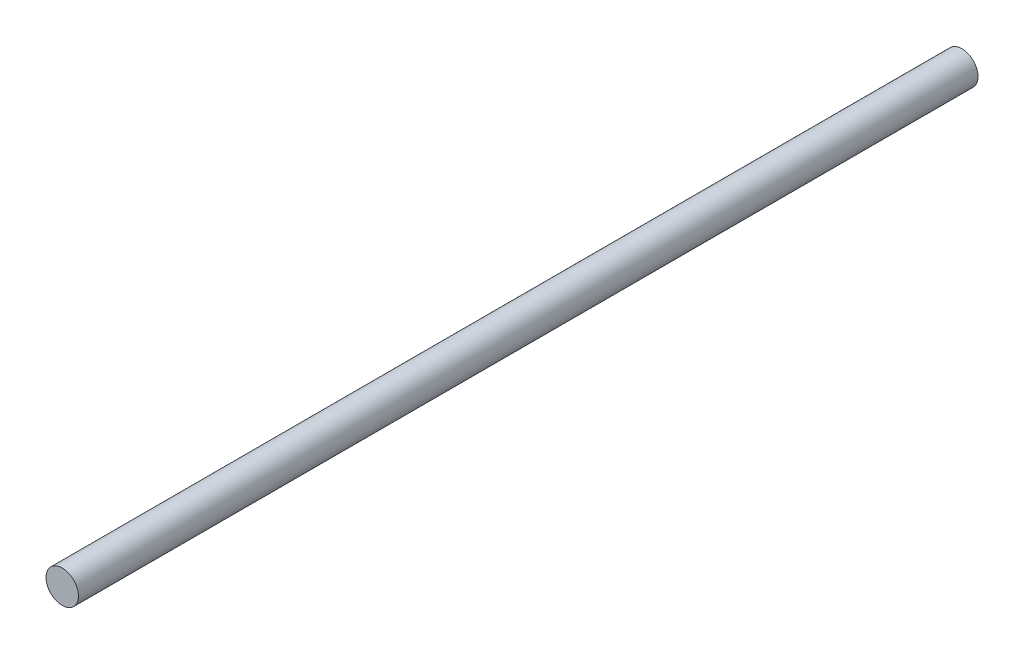
ISO-10303-21;
HEADER;
FILE_DESCRIPTION(('STEP AP214'),'2;1');
FILE_NAME('part.step','',(''),(''),'','','');
FILE_SCHEMA(('AUTOMOTIVE_DESIGN { 1 0 10303 214 1 1 1 1 }'));
ENDSEC;
DATA;
#1=APPLICATION_CONTEXT('core data for automotive mechanical design processes');
#2=APPLICATION_PROTOCOL_DEFINITION('international standard','automotive_design',2000,#1);
#3=PRODUCT_CONTEXT('',#1,'mechanical');
#4=PRODUCT('Part','Part','',(#3));
#5=PRODUCT_RELATED_PRODUCT_CATEGORY('part','',(#4));
#6=PRODUCT_DEFINITION_FORMATION('','',#4);
#7=PRODUCT_DEFINITION_CONTEXT('part definition',#1,'design');
#8=PRODUCT_DEFINITION('design','',#6,#7);
#9=PRODUCT_DEFINITION_SHAPE('','',#8);
#10=(LENGTH_UNIT() NAMED_UNIT(*) SI_UNIT(.MILLI.,.METRE.));
#11=(NAMED_UNIT(*) PLANE_ANGLE_UNIT() SI_UNIT($,.RADIAN.));
#12=(NAMED_UNIT(*) SI_UNIT($,.STERADIAN.) SOLID_ANGLE_UNIT());
#13=UNCERTAINTY_MEASURE_WITH_UNIT(LENGTH_MEASURE(1.E-05),#10,'distance_accuracy_value','');
#14=(GEOMETRIC_REPRESENTATION_CONTEXT(3) GLOBAL_UNCERTAINTY_ASSIGNED_CONTEXT((#13)) GLOBAL_UNIT_ASSIGNED_CONTEXT((#10,
#11,#12)) REPRESENTATION_CONTEXT('',''));
#15=CARTESIAN_POINT('',(0.,0.,0.));
#16=DIRECTION('',(0.,0.,1.));
#17=DIRECTION('',(1.,0.,0.));
#18=AXIS2_PLACEMENT_3D('',#15,#16,#17);
#19=CARTESIAN_POINT('',(0.,0.,194.));
#20=DIRECTION('',(0.,0.,-1.));
#21=DIRECTION('',(-1.,0.,0.));
#22=AXIS2_PLACEMENT_3D('',#19,#20,#21);
#23=CYLINDRICAL_SURFACE('',#22,3.5);
#24=CARTESIAN_POINT('',(0.,0.,194.));
#25=DIRECTION('',(0.,0.,1.));
#26=DIRECTION('',(1.,0.,0.));
#27=AXIS2_PLACEMENT_3D('',#24,#25,#26);
#28=CIRCLE('',#27,3.5);
#29=CARTESIAN_POINT('',(-3.5,0.,194.));
#30=VERTEX_POINT('',#29);
#31=EDGE_CURVE('E10',#30,#30,#28,.T.);
#32=CARTESIAN_POINT('',(0.,0.,0.));
#33=DIRECTION('',(0.,0.,1.));
#34=DIRECTION('',(1.,0.,0.));
#35=AXIS2_PLACEMENT_3D('',#32,#33,#34);
#36=CIRCLE('',#35,3.5);
#37=CARTESIAN_POINT('',(-3.5,0.,0.));
#38=VERTEX_POINT('',#37);
#39=EDGE_CURVE('E43',#38,#38,#36,.T.);
#40=CARTESIAN_POINT('',(-3.5,0.,194.));
#41=CARTESIAN_POINT('',(-3.5,0.,191.979166666667));
#42=CARTESIAN_POINT('',(-3.5,0.,189.958333333333));
#43=CARTESIAN_POINT('',(-3.5,0.,185.916666666667));
#44=CARTESIAN_POINT('',(-3.5,0.,183.895833333333));
#45=CARTESIAN_POINT('',(-3.5,0.,179.854166666667));
#46=CARTESIAN_POINT('',(-3.5,0.,177.833333333333));
#47=CARTESIAN_POINT('',(-3.5,0.,173.791666666667));
#48=CARTESIAN_POINT('',(-3.5,0.,171.770833333333));
#49=CARTESIAN_POINT('',(-3.5,0.,167.729166666667));
#50=CARTESIAN_POINT('',(-3.5,0.,165.708333333333));
#51=CARTESIAN_POINT('',(-3.5,0.,161.666666666667));
#52=CARTESIAN_POINT('',(-3.5,0.,159.645833333333));
#53=CARTESIAN_POINT('',(-3.5,0.,155.604166666667));
#54=CARTESIAN_POINT('',(-3.5,0.,153.583333333333));
#55=CARTESIAN_POINT('',(-3.5,0.,149.541666666667));
#56=CARTESIAN_POINT('',(-3.5,0.,147.520833333333));
#57=CARTESIAN_POINT('',(-3.5,0.,143.479166666667));
#58=CARTESIAN_POINT('',(-3.5,0.,141.458333333333));
#59=CARTESIAN_POINT('',(-3.5,0.,137.416666666667));
#60=CARTESIAN_POINT('',(-3.5,0.,135.395833333333));
#61=CARTESIAN_POINT('',(-3.5,0.,131.354166666667));
#62=CARTESIAN_POINT('',(-3.5,0.,129.333333333333));
#63=CARTESIAN_POINT('',(-3.5,0.,125.291666666667));
#64=CARTESIAN_POINT('',(-3.5,0.,123.270833333333));
#65=CARTESIAN_POINT('',(-3.5,0.,119.229166666667));
#66=CARTESIAN_POINT('',(-3.5,0.,117.208333333333));
#67=CARTESIAN_POINT('',(-3.5,0.,113.166666666667));
#68=CARTESIAN_POINT('',(-3.5,0.,111.145833333333));
#69=CARTESIAN_POINT('',(-3.5,0.,107.104166666667));
#70=CARTESIAN_POINT('',(-3.5,0.,105.083333333333));
#71=CARTESIAN_POINT('',(-3.5,0.,101.041666666667));
#72=CARTESIAN_POINT('',(-3.5,0.,99.0208333333333));
#73=CARTESIAN_POINT('',(-3.5,0.,94.9791666666667));
#74=CARTESIAN_POINT('',(-3.5,0.,92.9583333333333));
#75=CARTESIAN_POINT('',(-3.5,0.,88.9166666666667));
#76=CARTESIAN_POINT('',(-3.5,0.,86.8958333333333));
#77=CARTESIAN_POINT('',(-3.5,0.,82.8541666666667));
#78=CARTESIAN_POINT('',(-3.5,0.,80.8333333333333));
#79=CARTESIAN_POINT('',(-3.5,0.,76.7916666666666));
#80=CARTESIAN_POINT('',(-3.5,0.,74.7708333333333));
#81=CARTESIAN_POINT('',(-3.5,0.,70.7291666666666));
#82=CARTESIAN_POINT('',(-3.5,0.,68.7083333333333));
#83=CARTESIAN_POINT('',(-3.5,0.,64.6666666666667));
#84=CARTESIAN_POINT('',(-3.5,0.,62.6458333333333));
#85=CARTESIAN_POINT('',(-3.5,0.,58.6041666666667));
#86=CARTESIAN_POINT('',(-3.5,0.,56.5833333333333));
#87=CARTESIAN_POINT('',(-3.5,0.,52.5416666666667));
#88=CARTESIAN_POINT('',(-3.5,0.,50.5208333333333));
#89=CARTESIAN_POINT('',(-3.5,0.,46.4791666666667));
#90=CARTESIAN_POINT('',(-3.5,0.,44.4583333333333));
#91=CARTESIAN_POINT('',(-3.5,0.,40.4166666666667));
#92=CARTESIAN_POINT('',(-3.5,0.,38.3958333333333));
#93=CARTESIAN_POINT('',(-3.5,0.,34.3541666666667));
#94=CARTESIAN_POINT('',(-3.5,0.,32.3333333333333));
#95=CARTESIAN_POINT('',(-3.5,0.,28.2916666666666));
#96=CARTESIAN_POINT('',(-3.5,0.,26.2708333333333));
#97=CARTESIAN_POINT('',(-3.5,0.,22.2291666666666));
#98=CARTESIAN_POINT('',(-3.5,0.,20.2083333333333));
#99=CARTESIAN_POINT('',(-3.5,0.,16.1666666666666));
#100=CARTESIAN_POINT('',(-3.5,0.,14.1458333333333));
#101=CARTESIAN_POINT('',(-3.5,0.,10.1041666666666));
#102=CARTESIAN_POINT('',(-3.5,0.,8.0833333333333));
#103=CARTESIAN_POINT('',(-3.5,0.,4.04166666666664));
#104=CARTESIAN_POINT('',(-3.5,0.,2.02083333333331));
#105=CARTESIAN_POINT('',(-3.5,0.,0.));
#106=B_SPLINE_CURVE_WITH_KNOTS('',3,(#40,#41,#42,#43,#44,#45,#46,#47,#48,#49,#50,#51,#52,#53,
#54,#55,#56,#57,#58,#59,#60,#61,#62,#63,#64,#65,#66,#67,#68,#69,#70,#71,#72,#73,#74,#75,#76,#77,
#78,#79,#80,#81,#82,#83,#84,#85,#86,#87,#88,#89,#90,#91,#92,#93,#94,#95,#96,#97,#98,#99,#100,
#101,#102,#103,#104,#105),.UNSPECIFIED.,.F.,.F.,(4,2,2,2,2,2,2,2,2,2,2,2,2,2,2,2,2,2,2,2,2,2,2,
2,2,2,2,2,2,2,2,2,4),(0.,6.0625,12.125,18.1875,24.25,30.3125,36.375,42.4375,48.5,54.5625,60.625,
66.6875,72.75,78.8125,84.875,90.9375,97.,103.0625,109.125,115.1875,121.25,127.3125,133.375,
139.4375,145.5,151.5625,157.625,163.6875,169.75,175.8125,181.875,187.9375,194.),.UNSPECIFIED.);
#107=EDGE_CURVE('BSEAM40',#30,#38,#106,.T.);
#108=ORIENTED_EDGE('',*,*,#31,.F.);
#109=ORIENTED_EDGE('',*,*,#39,.T.);
#110=ORIENTED_EDGE('',*,*,#107,.T.);
#111=ORIENTED_EDGE('',*,*,#107,.F.);
#112=EDGE_LOOP('',(#108,#110,#109,#111));
#113=FACE_BOUND('',#112,.T.);
#114=ADVANCED_FACE('F40',(#113),#23,.T.);
#115=CARTESIAN_POINT('',(0.,0.,194.));
#116=DIRECTION('',(0.,0.,1.));
#117=DIRECTION('',(1.,0.,0.));
#118=AXIS2_PLACEMENT_3D('',#115,#116,#117);
#119=PLANE('',#118);
#120=ORIENTED_EDGE('',*,*,#31,.T.);
#121=EDGE_LOOP('',(#120));
#122=FACE_BOUND('',#121,.T.);
#123=ADVANCED_FACE('F57',(#122),#119,.T.);
#124=CARTESIAN_POINT('',(0.,0.,0.));
#125=DIRECTION('',(0.,0.,1.));
#126=DIRECTION('',(1.,0.,0.));
#127=AXIS2_PLACEMENT_3D('',#124,#125,#126);
#128=PLANE('',#127);
#129=ORIENTED_EDGE('',*,*,#39,.F.);
#130=EDGE_LOOP('',(#129));
#131=FACE_BOUND('',#130,.T.);
#132=ADVANCED_FACE('F55',(#131),#128,.F.);
#133=CLOSED_SHELL('',(#114,#123,#132));
#134=MANIFOLD_SOLID_BREP('B2',#133);
#135=ADVANCED_BREP_SHAPE_REPRESENTATION('',(#18,#134),#14);
#136=SHAPE_DEFINITION_REPRESENTATION(#9,#135);
ENDSEC;
END-ISO-10303-21;
